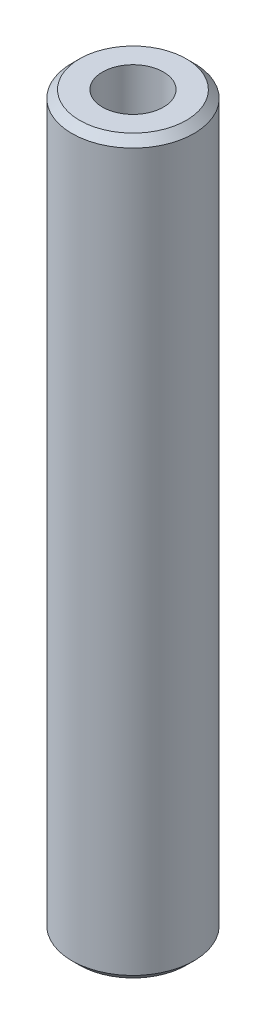
ISO-10303-21;
HEADER;
FILE_DESCRIPTION(('STEP AP214'),'2;1');
FILE_NAME('part.step','',(''),(''),'','','');
FILE_SCHEMA(('AUTOMOTIVE_DESIGN { 1 0 10303 214 1 1 1 1 }'));
ENDSEC;
DATA;
#1=APPLICATION_CONTEXT('core data for automotive mechanical design processes');
#2=APPLICATION_PROTOCOL_DEFINITION('international standard','automotive_design',2000,#1);
#3=PRODUCT_CONTEXT('',#1,'mechanical');
#4=PRODUCT('Part','Part','',(#3));
#5=PRODUCT_RELATED_PRODUCT_CATEGORY('part','',(#4));
#6=PRODUCT_DEFINITION_FORMATION('','',#4);
#7=PRODUCT_DEFINITION_CONTEXT('part definition',#1,'design');
#8=PRODUCT_DEFINITION('design','',#6,#7);
#9=PRODUCT_DEFINITION_SHAPE('','',#8);
#10=(LENGTH_UNIT() NAMED_UNIT(*) SI_UNIT(.MILLI.,.METRE.));
#11=(NAMED_UNIT(*) PLANE_ANGLE_UNIT() SI_UNIT($,.RADIAN.));
#12=(NAMED_UNIT(*) SI_UNIT($,.STERADIAN.) SOLID_ANGLE_UNIT());
#13=UNCERTAINTY_MEASURE_WITH_UNIT(LENGTH_MEASURE(1.E-05),#10,'distance_accuracy_value','');
#14=(GEOMETRIC_REPRESENTATION_CONTEXT(3) GLOBAL_UNCERTAINTY_ASSIGNED_CONTEXT((#13)) GLOBAL_UNIT_ASSIGNED_CONTEXT((#10,
#11,#12)) REPRESENTATION_CONTEXT('',''));
#15=CARTESIAN_POINT('',(0.,0.,0.));
#16=DIRECTION('',(0.,0.,1.));
#17=DIRECTION('',(1.,0.,0.));
#18=AXIS2_PLACEMENT_3D('',#15,#16,#17);
#19=CARTESIAN_POINT('',(0.,48.,0.));
#20=DIRECTION('',(0.,1.,0.));
#21=DIRECTION('',(0.,0.,1.));
#22=AXIS2_PLACEMENT_3D('',#19,#20,#21);
#23=PLANE('',#22);
#24=CARTESIAN_POINT('',(0.,48.,0.));
#25=DIRECTION('',(0.,1.,0.));
#26=DIRECTION('',(0.,0.,1.));
#27=AXIS2_PLACEMENT_3D('',#24,#25,#26);
#28=CIRCLE('',#27,3.5);
#29=CARTESIAN_POINT('',(0.,48.,3.5));
#30=VERTEX_POINT('',#29);
#31=EDGE_CURVE('E10',#30,#30,#28,.T.);
#32=ORIENTED_EDGE('',*,*,#31,.T.);
#33=EDGE_LOOP('',(#32));
#34=FACE_BOUND('',#33,.T.);
#35=CARTESIAN_POINT('',(0.,48.,0.));
#36=DIRECTION('',(0.,1.,0.));
#37=DIRECTION('',(0.,0.,1.));
#38=AXIS2_PLACEMENT_3D('',#35,#36,#37);
#39=CIRCLE('',#38,2.);
#40=CARTESIAN_POINT('',(0.,48.,2.));
#41=VERTEX_POINT('',#40);
#42=EDGE_CURVE('E54',#41,#41,#39,.T.);
#43=ORIENTED_EDGE('',*,*,#42,.F.);
#44=EDGE_LOOP('',(#43));
#45=FACE_BOUND('',#44,.T.);
#46=ADVANCED_FACE('F33',(#34,#45),#23,.T.);
#47=CARTESIAN_POINT('',(0.,0.,0.));
#48=DIRECTION('',(0.,1.,0.));
#49=DIRECTION('',(0.,0.,1.));
#50=AXIS2_PLACEMENT_3D('',#47,#48,#49);
#51=PLANE('',#50);
#52=CARTESIAN_POINT('',(0.,0.,0.));
#53=DIRECTION('',(0.,1.,0.));
#54=DIRECTION('',(0.,0.,1.));
#55=AXIS2_PLACEMENT_3D('',#52,#53,#54);
#56=CIRCLE('',#55,3.5);
#57=CARTESIAN_POINT('',(0.,0.,3.5));
#58=VERTEX_POINT('',#57);
#59=EDGE_CURVE('E41',#58,#58,#56,.F.);
#60=ORIENTED_EDGE('',*,*,#59,.T.);
#61=EDGE_LOOP('',(#60));
#62=FACE_BOUND('',#61,.T.);
#63=CARTESIAN_POINT('',(0.,0.,0.));
#64=DIRECTION('',(0.,1.,0.));
#65=DIRECTION('',(0.,0.,1.));
#66=AXIS2_PLACEMENT_3D('',#63,#64,#65);
#67=CIRCLE('',#66,2.);
#68=CARTESIAN_POINT('',(0.,0.,2.));
#69=VERTEX_POINT('',#68);
#70=EDGE_CURVE('E55',#69,#69,#67,.T.);
#71=ORIENTED_EDGE('',*,*,#70,.T.);
#72=EDGE_LOOP('',(#71));
#73=FACE_BOUND('',#72,.T.);
#74=ADVANCED_FACE('F65',(#62,#73),#51,.F.);
#75=CARTESIAN_POINT('',(0.,48.,0.));
#76=DIRECTION('',(0.,-1.,0.));
#77=DIRECTION('',(0.,0.,-1.));
#78=AXIS2_PLACEMENT_3D('',#75,#76,#77);
#79=CYLINDRICAL_SURFACE('',#78,4.);
#80=CARTESIAN_POINT('',(0.,0.5,0.));
#81=DIRECTION('',(0.,1.,0.));
#82=DIRECTION('',(0.,0.,1.));
#83=AXIS2_PLACEMENT_3D('',#80,#81,#82);
#84=CIRCLE('',#83,4.);
#85=CARTESIAN_POINT('',(0.,0.5,4.));
#86=VERTEX_POINT('',#85);
#87=EDGE_CURVE('E45',#86,#86,#84,.T.);
#88=ORIENTED_EDGE('',*,*,#87,.T.);
#89=EDGE_LOOP('',(#88));
#90=FACE_BOUND('',#89,.T.);
#91=CARTESIAN_POINT('',(0.,47.5,0.));
#92=DIRECTION('',(0.,1.,0.));
#93=DIRECTION('',(0.,0.,1.));
#94=AXIS2_PLACEMENT_3D('',#91,#92,#93);
#95=CIRCLE('',#94,4.);
#96=CARTESIAN_POINT('',(0.,47.5,4.));
#97=VERTEX_POINT('',#96);
#98=EDGE_CURVE('E49',#97,#97,#95,.F.);
#99=ORIENTED_EDGE('',*,*,#98,.T.);
#100=EDGE_LOOP('',(#99));
#101=FACE_BOUND('',#100,.T.);
#102=ADVANCED_FACE('F70',(#90,#101),#79,.T.);
#103=CARTESIAN_POINT('',(0.,48.,0.));
#104=DIRECTION('',(0.,-1.,0.));
#105=DIRECTION('',(0.,0.,-1.));
#106=AXIS2_PLACEMENT_3D('',#103,#104,#105);
#107=CYLINDRICAL_SURFACE('',#106,2.);
#108=ORIENTED_EDGE('',*,*,#42,.T.);
#109=EDGE_LOOP('',(#108));
#110=FACE_BOUND('',#109,.T.);
#111=ORIENTED_EDGE('',*,*,#70,.F.);
#112=EDGE_LOOP('',(#111));
#113=FACE_BOUND('',#112,.T.);
#114=ADVANCED_FACE('F61',(#110,#113),#107,.F.);
#115=CARTESIAN_POINT('',(0.,0.5,0.));
#116=DIRECTION('',(0.,1.,0.));
#117=DIRECTION('',(0.,0.,1.));
#118=AXIS2_PLACEMENT_3D('',#115,#116,#117);
#119=CONICAL_SURFACE('',#118,4.,0.785398163397445);
#120=ORIENTED_EDGE('',*,*,#59,.F.);
#121=EDGE_LOOP('',(#120));
#122=FACE_BOUND('',#121,.T.);
#123=ORIENTED_EDGE('',*,*,#87,.F.);
#124=EDGE_LOOP('',(#123));
#125=FACE_BOUND('',#124,.T.);
#126=ADVANCED_FACE('F77',(#122,#125),#119,.T.);
#127=CARTESIAN_POINT('',(0.,48.,0.));
#128=DIRECTION('',(0.,-1.,0.));
#129=DIRECTION('',(0.,0.,-1.));
#130=AXIS2_PLACEMENT_3D('',#127,#128,#129);
#131=CONICAL_SURFACE('',#130,3.5,0.785398163397438);
#132=ORIENTED_EDGE('',*,*,#98,.F.);
#133=EDGE_LOOP('',(#132));
#134=FACE_BOUND('',#133,.T.);
#135=ORIENTED_EDGE('',*,*,#31,.F.);
#136=EDGE_LOOP('',(#135));
#137=FACE_BOUND('',#136,.T.);
#138=ADVANCED_FACE('F36',(#134,#137),#131,.T.);
#139=CLOSED_SHELL('',(#46,#74,#102,#114,#126,#138));
#140=MANIFOLD_SOLID_BREP('B2',#139);
#141=ADVANCED_BREP_SHAPE_REPRESENTATION('',(#18,#140),#14);
#142=SHAPE_DEFINITION_REPRESENTATION(#9,#141);
ENDSEC;
END-ISO-10303-21;
